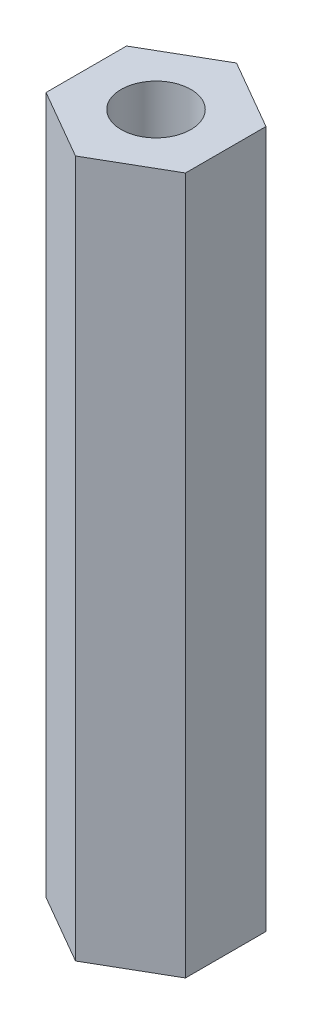
ISO-10303-21;
HEADER;
FILE_DESCRIPTION(('STEP AP214'),'2;1');
FILE_NAME('part.step','',(''),(''),'','','');
FILE_SCHEMA(('AUTOMOTIVE_DESIGN { 1 0 10303 214 1 1 1 1 }'));
ENDSEC;
DATA;
#1=APPLICATION_CONTEXT('core data for automotive mechanical design processes');
#2=APPLICATION_PROTOCOL_DEFINITION('international standard','automotive_design',2000,#1);
#3=PRODUCT_CONTEXT('',#1,'mechanical');
#4=PRODUCT('Part','Part','',(#3));
#5=PRODUCT_RELATED_PRODUCT_CATEGORY('part','',(#4));
#6=PRODUCT_DEFINITION_FORMATION('','',#4);
#7=PRODUCT_DEFINITION_CONTEXT('part definition',#1,'design');
#8=PRODUCT_DEFINITION('design','',#6,#7);
#9=PRODUCT_DEFINITION_SHAPE('','',#8);
#10=(LENGTH_UNIT() NAMED_UNIT(*) SI_UNIT(.MILLI.,.METRE.));
#11=(NAMED_UNIT(*) PLANE_ANGLE_UNIT() SI_UNIT($,.RADIAN.));
#12=(NAMED_UNIT(*) SI_UNIT($,.STERADIAN.) SOLID_ANGLE_UNIT());
#13=UNCERTAINTY_MEASURE_WITH_UNIT(LENGTH_MEASURE(1.E-05),#10,'distance_accuracy_value','');
#14=(GEOMETRIC_REPRESENTATION_CONTEXT(3) GLOBAL_UNCERTAINTY_ASSIGNED_CONTEXT((#13)) GLOBAL_UNIT_ASSIGNED_CONTEXT((#10,
#11,#12)) REPRESENTATION_CONTEXT('',''));
#15=CARTESIAN_POINT('',(0.,0.,0.));
#16=DIRECTION('',(0.,0.,1.));
#17=DIRECTION('',(1.,0.,0.));
#18=AXIS2_PLACEMENT_3D('',#15,#16,#17);
#19=CARTESIAN_POINT('',(2.99999999999997,30.,-1.73205080756891));
#20=DIRECTION('',(-0.499999999999995,0.,0.866025403784442));
#21=DIRECTION('',(0.866025403784442,0.,0.499999999999995));
#22=AXIS2_PLACEMENT_3D('',#19,#20,#21);
#23=PLANE('',#22);
#24=DIRECTION('',(-0.866025403784442,0.,-0.499999999999995));
#25=VECTOR('',#24,1.);
#26=CARTESIAN_POINT('',(2.99999999999997,0.,-1.73205080756891));
#27=LINE('',#26,#25);
#28=CARTESIAN_POINT('',(2.99999999999997,0.,-1.73205080756891));
#29=VERTEX_POINT('',#28);
#30=CARTESIAN_POINT('',(0.,0.,-3.46410161513775));
#31=VERTEX_POINT('',#30);
#32=EDGE_CURVE('E118',#29,#31,#27,.T.);
#33=ORIENTED_EDGE('',*,*,#32,.T.);
#34=DIRECTION('',(0.,-1.,0.));
#35=VECTOR('',#34,1.);
#36=CARTESIAN_POINT('',(0.,30.,-3.46410161513775));
#37=LINE('',#36,#35);
#38=CARTESIAN_POINT('',(0.,30.,-3.46410161513775));
#39=VERTEX_POINT('',#38);
#40=EDGE_CURVE('E11',#39,#31,#37,.T.);
#41=ORIENTED_EDGE('',*,*,#40,.F.);
#42=DIRECTION('',(-0.866025403784442,0.,-0.499999999999995));
#43=VECTOR('',#42,1.);
#44=CARTESIAN_POINT('',(2.99999999999997,30.,-1.73205080756891));
#45=LINE('',#44,#43);
#46=CARTESIAN_POINT('',(2.99999999999997,30.,-1.73205080756891));
#47=VERTEX_POINT('',#46);
#48=EDGE_CURVE('E128',#47,#39,#45,.T.);
#49=ORIENTED_EDGE('',*,*,#48,.F.);
#50=DIRECTION('',(0.,-1.,0.));
#51=VECTOR('',#50,1.);
#52=CARTESIAN_POINT('',(2.99999999999997,30.,-1.73205080756891));
#53=LINE('',#52,#51);
#54=EDGE_CURVE('E114',#47,#29,#53,.T.);
#55=ORIENTED_EDGE('',*,*,#54,.T.);
#56=EDGE_LOOP('',(#33,#41,#49,#55));
#57=FACE_BOUND('',#56,.T.);
#58=ADVANCED_FACE('F33',(#57),#23,.F.);
#59=CARTESIAN_POINT('',(0.,30.,-3.46410161513775));
#60=DIRECTION('',(0.500000000000001,0.,0.866025403784438));
#61=DIRECTION('',(0.866025403784438,0.,-0.500000000000001));
#62=AXIS2_PLACEMENT_3D('',#59,#60,#61);
#63=PLANE('',#62);
#64=DIRECTION('',(-0.866025403784438,0.,0.500000000000001));
#65=VECTOR('',#64,1.);
#66=CARTESIAN_POINT('',(0.,0.,-3.46410161513775));
#67=LINE('',#66,#65);
#68=CARTESIAN_POINT('',(-3.,0.,-1.73205080756887));
#69=VERTEX_POINT('',#68);
#70=EDGE_CURVE('E121',#31,#69,#67,.T.);
#71=ORIENTED_EDGE('',*,*,#70,.T.);
#72=DIRECTION('',(0.,-1.,0.));
#73=VECTOR('',#72,1.);
#74=CARTESIAN_POINT('',(-3.,30.,-1.73205080756887));
#75=LINE('',#74,#73);
#76=CARTESIAN_POINT('',(-3.,30.,-1.73205080756887));
#77=VERTEX_POINT('',#76);
#78=EDGE_CURVE('E42',#77,#69,#75,.T.);
#79=ORIENTED_EDGE('',*,*,#78,.F.);
#80=DIRECTION('',(-0.866025403784438,0.,0.500000000000001));
#81=VECTOR('',#80,1.);
#82=CARTESIAN_POINT('',(0.,30.,-3.46410161513775));
#83=LINE('',#82,#81);
#84=EDGE_CURVE('E87',#39,#77,#83,.T.);
#85=ORIENTED_EDGE('',*,*,#84,.F.);
#86=ORIENTED_EDGE('',*,*,#40,.T.);
#87=EDGE_LOOP('',(#71,#79,#85,#86));
#88=FACE_BOUND('',#87,.T.);
#89=ADVANCED_FACE('F154',(#88),#63,.F.);
#90=CARTESIAN_POINT('',(-3.,30.,-1.73205080756887));
#91=DIRECTION('',(1.,0.,0.));
#92=DIRECTION('',(0.,0.,-1.));
#93=AXIS2_PLACEMENT_3D('',#90,#91,#92);
#94=PLANE('',#93);
#95=DIRECTION('',(0.,0.,1.));
#96=VECTOR('',#95,1.);
#97=CARTESIAN_POINT('',(-3.,0.,-1.73205080756887));
#98=LINE('',#97,#96);
#99=CARTESIAN_POINT('',(-2.99999999999999,0.,1.73205080756889));
#100=VERTEX_POINT('',#99);
#101=EDGE_CURVE('E123',#69,#100,#98,.T.);
#102=ORIENTED_EDGE('',*,*,#101,.T.);
#103=DIRECTION('',(0.,-1.,0.));
#104=VECTOR('',#103,1.);
#105=CARTESIAN_POINT('',(-2.99999999999999,30.,1.73205080756889));
#106=LINE('',#105,#104);
#107=CARTESIAN_POINT('',(-2.99999999999999,30.,1.73205080756889));
#108=VERTEX_POINT('',#107);
#109=EDGE_CURVE('E109',#108,#100,#106,.T.);
#110=ORIENTED_EDGE('',*,*,#109,.F.);
#111=DIRECTION('',(0.,0.,1.));
#112=VECTOR('',#111,1.);
#113=CARTESIAN_POINT('',(-3.,30.,-1.73205080756887));
#114=LINE('',#113,#112);
#115=EDGE_CURVE('E100',#77,#108,#114,.T.);
#116=ORIENTED_EDGE('',*,*,#115,.F.);
#117=ORIENTED_EDGE('',*,*,#78,.T.);
#118=EDGE_LOOP('',(#102,#110,#116,#117));
#119=FACE_BOUND('',#118,.T.);
#120=ADVANCED_FACE('F135',(#119),#94,.F.);
#121=CARTESIAN_POINT('',(-2.99999999999999,30.,1.73205080756889));
#122=DIRECTION('',(0.499999999999995,0.,-0.866025403784441));
#123=DIRECTION('',(-0.866025403784441,0.,-0.499999999999995));
#124=AXIS2_PLACEMENT_3D('',#121,#122,#123);
#125=PLANE('',#124);
#126=DIRECTION('',(0.866025403784441,0.,0.499999999999995));
#127=VECTOR('',#126,1.);
#128=CARTESIAN_POINT('',(-2.99999999999999,0.,1.73205080756889));
#129=LINE('',#128,#127);
#130=CARTESIAN_POINT('',(0.,0.,3.46410161513775));
#131=VERTEX_POINT('',#130);
#132=EDGE_CURVE('E108',#100,#131,#129,.T.);
#133=ORIENTED_EDGE('',*,*,#132,.T.);
#134=DIRECTION('',(0.,-1.,0.));
#135=VECTOR('',#134,1.);
#136=CARTESIAN_POINT('',(0.,30.,3.46410161513775));
#137=LINE('',#136,#135);
#138=CARTESIAN_POINT('',(0.,30.,3.46410161513775));
#139=VERTEX_POINT('',#138);
#140=EDGE_CURVE('E105',#139,#131,#137,.T.);
#141=ORIENTED_EDGE('',*,*,#140,.F.);
#142=DIRECTION('',(0.866025403784441,0.,0.499999999999995));
#143=VECTOR('',#142,1.);
#144=CARTESIAN_POINT('',(-2.99999999999999,30.,1.73205080756889));
#145=LINE('',#144,#143);
#146=EDGE_CURVE('E94',#108,#139,#145,.T.);
#147=ORIENTED_EDGE('',*,*,#146,.F.);
#148=ORIENTED_EDGE('',*,*,#109,.T.);
#149=EDGE_LOOP('',(#133,#141,#147,#148));
#150=FACE_BOUND('',#149,.T.);
#151=ADVANCED_FACE('F106',(#150),#125,.F.);
#152=CARTESIAN_POINT('',(0.,30.,3.46410161513775));
#153=DIRECTION('',(-0.500000000000007,0.,-0.866025403784434));
#154=DIRECTION('',(-0.866025403784435,0.,0.500000000000007));
#155=AXIS2_PLACEMENT_3D('',#152,#153,#154);
#156=PLANE('',#155);
#157=DIRECTION('',(0.866025403784435,0.,-0.500000000000007));
#158=VECTOR('',#157,1.);
#159=CARTESIAN_POINT('',(0.,0.,3.46410161513775));
#160=LINE('',#159,#158);
#161=CARTESIAN_POINT('',(3.00000000000001,0.,1.73205080756885));
#162=VERTEX_POINT('',#161);
#163=EDGE_CURVE('E73',#131,#162,#160,.T.);
#164=ORIENTED_EDGE('',*,*,#163,.T.);
#165=DIRECTION('',(0.,-1.,0.));
#166=VECTOR('',#165,1.);
#167=CARTESIAN_POINT('',(3.00000000000001,30.,1.73205080756885));
#168=LINE('',#167,#166);
#169=CARTESIAN_POINT('',(3.00000000000001,30.,1.73205080756885));
#170=VERTEX_POINT('',#169);
#171=EDGE_CURVE('E110',#170,#162,#168,.T.);
#172=ORIENTED_EDGE('',*,*,#171,.F.);
#173=DIRECTION('',(0.866025403784435,0.,-0.500000000000007));
#174=VECTOR('',#173,1.);
#175=CARTESIAN_POINT('',(0.,30.,3.46410161513775));
#176=LINE('',#175,#174);
#177=EDGE_CURVE('E98',#139,#170,#176,.T.);
#178=ORIENTED_EDGE('',*,*,#177,.F.);
#179=ORIENTED_EDGE('',*,*,#140,.T.);
#180=EDGE_LOOP('',(#164,#172,#178,#179));
#181=FACE_BOUND('',#180,.T.);
#182=ADVANCED_FACE('F112',(#181),#156,.F.);
#183=CARTESIAN_POINT('',(3.00000000000001,30.,1.73205080756885));
#184=DIRECTION('',(-1.,0.,0.));
#185=DIRECTION('',(0.,0.,1.));
#186=AXIS2_PLACEMENT_3D('',#183,#184,#185);
#187=PLANE('',#186);
#188=DIRECTION('',(0.,0.,-1.));
#189=VECTOR('',#188,1.);
#190=CARTESIAN_POINT('',(3.00000000000001,0.,1.73205080756885));
#191=LINE('',#190,#189);
#192=EDGE_CURVE('E79',#162,#29,#191,.T.);
#193=ORIENTED_EDGE('',*,*,#192,.T.);
#194=ORIENTED_EDGE('',*,*,#54,.F.);
#195=DIRECTION('',(0.,0.,-1.));
#196=VECTOR('',#195,1.);
#197=CARTESIAN_POINT('',(3.00000000000001,30.,1.73205080756885));
#198=LINE('',#197,#196);
#199=EDGE_CURVE('E50',#170,#47,#198,.T.);
#200=ORIENTED_EDGE('',*,*,#199,.F.);
#201=ORIENTED_EDGE('',*,*,#171,.T.);
#202=EDGE_LOOP('',(#193,#194,#200,#201));
#203=FACE_BOUND('',#202,.T.);
#204=ADVANCED_FACE('F142',(#203),#187,.F.);
#205=CARTESIAN_POINT('',(0.,30.,0.));
#206=DIRECTION('',(0.,1.,0.));
#207=DIRECTION('',(0.,0.,1.));
#208=AXIS2_PLACEMENT_3D('',#205,#206,#207);
#209=PLANE('',#208);
#210=CARTESIAN_POINT('',(0.,30.,0.));
#211=DIRECTION('',(0.,1.,0.));
#212=DIRECTION('',(0.,0.,1.));
#213=AXIS2_PLACEMENT_3D('',#210,#211,#212);
#214=CIRCLE('',#213,1.5);
#215=CARTESIAN_POINT('',(0.,30.,1.5));
#216=VERTEX_POINT('',#215);
#217=EDGE_CURVE('E207',#216,#216,#214,.T.);
#218=ORIENTED_EDGE('',*,*,#217,.F.);
#219=EDGE_LOOP('',(#218));
#220=FACE_BOUND('',#219,.T.);
#221=ORIENTED_EDGE('',*,*,#48,.T.);
#222=ORIENTED_EDGE('',*,*,#84,.T.);
#223=ORIENTED_EDGE('',*,*,#115,.T.);
#224=ORIENTED_EDGE('',*,*,#146,.T.);
#225=ORIENTED_EDGE('',*,*,#177,.T.);
#226=ORIENTED_EDGE('',*,*,#199,.T.);
#227=EDGE_LOOP('',(#221,#222,#223,#224,#225,#226));
#228=FACE_BOUND('',#227,.T.);
#229=ADVANCED_FACE('F96',(#220,#228),#209,.T.);
#230=CARTESIAN_POINT('',(0.,0.,0.));
#231=DIRECTION('',(0.,1.,0.));
#232=DIRECTION('',(0.,0.,1.));
#233=AXIS2_PLACEMENT_3D('',#230,#231,#232);
#234=PLANE('',#233);
#235=CARTESIAN_POINT('',(0.,0.,0.));
#236=DIRECTION('',(0.,1.,0.));
#237=DIRECTION('',(0.,0.,1.));
#238=AXIS2_PLACEMENT_3D('',#235,#236,#237);
#239=CIRCLE('',#238,1.5);
#240=CARTESIAN_POINT('',(0.,0.,1.5));
#241=VERTEX_POINT('',#240);
#242=EDGE_CURVE('E36',#241,#241,#239,.T.);
#243=ORIENTED_EDGE('',*,*,#242,.T.);
#244=EDGE_LOOP('',(#243));
#245=FACE_BOUND('',#244,.T.);
#246=ORIENTED_EDGE('',*,*,#32,.F.);
#247=ORIENTED_EDGE('',*,*,#192,.F.);
#248=ORIENTED_EDGE('',*,*,#163,.F.);
#249=ORIENTED_EDGE('',*,*,#132,.F.);
#250=ORIENTED_EDGE('',*,*,#101,.F.);
#251=ORIENTED_EDGE('',*,*,#70,.F.);
#252=EDGE_LOOP('',(#246,#247,#248,#249,#250,#251));
#253=FACE_BOUND('',#252,.T.);
#254=ADVANCED_FACE('F138',(#245,#253),#234,.F.);
#255=CARTESIAN_POINT('',(0.,-20.,0.));
#256=DIRECTION('',(0.,1.,0.));
#257=DIRECTION('',(0.,0.,1.));
#258=AXIS2_PLACEMENT_3D('',#255,#256,#257);
#259=CYLINDRICAL_SURFACE('',#258,1.5);
#260=ORIENTED_EDGE('',*,*,#217,.T.);
#261=EDGE_LOOP('',(#260));
#262=FACE_BOUND('',#261,.T.);
#263=ORIENTED_EDGE('',*,*,#242,.F.);
#264=EDGE_LOOP('',(#263));
#265=FACE_BOUND('',#264,.T.);
#266=ADVANCED_FACE('F191',(#262,#265),#259,.F.);
#267=CLOSED_SHELL('',(#58,#89,#120,#151,#182,#204,#229,#254,#266));
#268=MANIFOLD_SOLID_BREP('B2',#267);
#269=ADVANCED_BREP_SHAPE_REPRESENTATION('',(#18,#268),#14);
#270=SHAPE_DEFINITION_REPRESENTATION(#9,#269);
ENDSEC;
END-ISO-10303-21;
